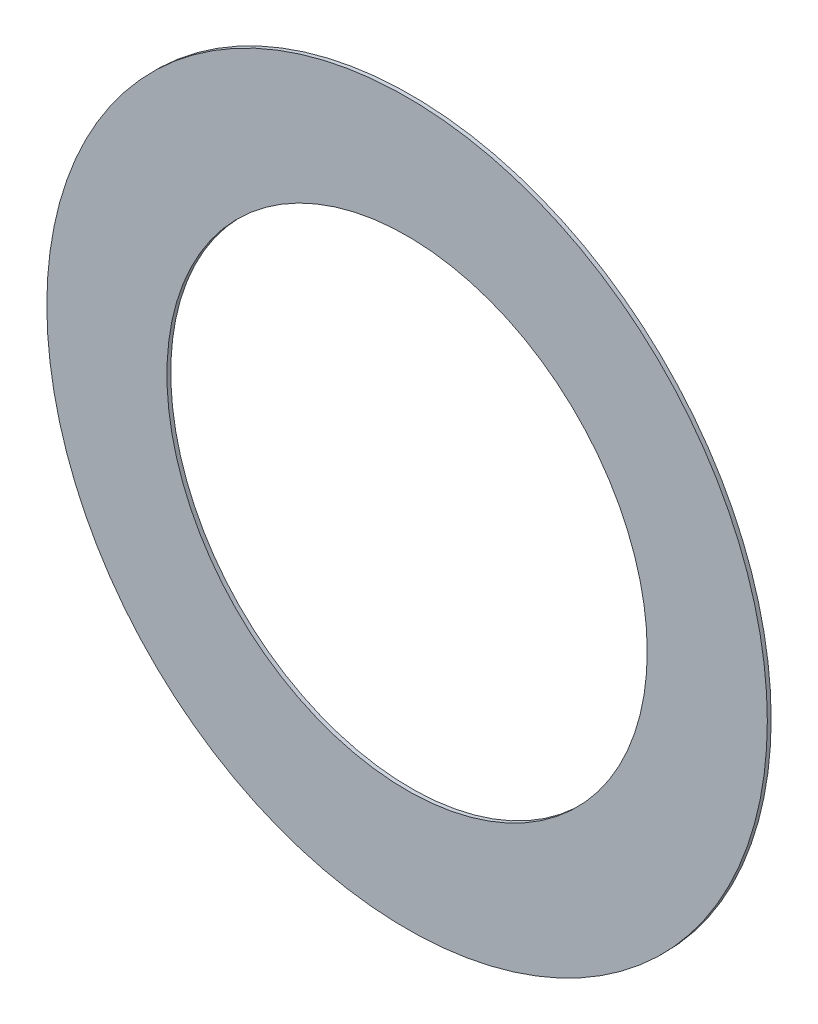
ISO-10303-21;
HEADER;
FILE_DESCRIPTION(('STEP AP214'),'2;1');
FILE_NAME('part.step','',(''),(''),'','','');
FILE_SCHEMA(('AUTOMOTIVE_DESIGN { 1 0 10303 214 1 1 1 1 }'));
ENDSEC;
DATA;
#1=APPLICATION_CONTEXT('core data for automotive mechanical design processes');
#2=APPLICATION_PROTOCOL_DEFINITION('international standard','automotive_design',2000,#1);
#3=PRODUCT_CONTEXT('',#1,'mechanical');
#4=PRODUCT('Part','Part','',(#3));
#5=PRODUCT_RELATED_PRODUCT_CATEGORY('part','',(#4));
#6=PRODUCT_DEFINITION_FORMATION('','',#4);
#7=PRODUCT_DEFINITION_CONTEXT('part definition',#1,'design');
#8=PRODUCT_DEFINITION('design','',#6,#7);
#9=PRODUCT_DEFINITION_SHAPE('','',#8);
#10=(LENGTH_UNIT() NAMED_UNIT(*) SI_UNIT(.MILLI.,.METRE.));
#11=(NAMED_UNIT(*) PLANE_ANGLE_UNIT() SI_UNIT($,.RADIAN.));
#12=(NAMED_UNIT(*) SI_UNIT($,.STERADIAN.) SOLID_ANGLE_UNIT());
#13=UNCERTAINTY_MEASURE_WITH_UNIT(LENGTH_MEASURE(1.E-05),#10,'distance_accuracy_value','');
#14=(GEOMETRIC_REPRESENTATION_CONTEXT(3) GLOBAL_UNCERTAINTY_ASSIGNED_CONTEXT((#13)) GLOBAL_UNIT_ASSIGNED_CONTEXT((#10,
#11,#12)) REPRESENTATION_CONTEXT('',''));
#15=CARTESIAN_POINT('',(0.,0.,0.));
#16=DIRECTION('',(0.,0.,1.));
#17=DIRECTION('',(1.,0.,0.));
#18=AXIS2_PLACEMENT_3D('',#15,#16,#17);
#19=CARTESIAN_POINT('',(0.,0.,0.0127));
#20=DIRECTION('',(0.,0.,1.));
#21=DIRECTION('',(1.,0.,0.));
#22=AXIS2_PLACEMENT_3D('',#19,#20,#21);
#23=PLANE('',#22);
#24=CARTESIAN_POINT('',(0.,0.,0.0127));
#25=DIRECTION('',(0.,0.,1.));
#26=DIRECTION('',(1.,0.,0.));
#27=AXIS2_PLACEMENT_3D('',#24,#25,#26);
#28=CIRCLE('',#27,2.38125);
#29=CARTESIAN_POINT('',(2.38125,0.,0.0127));
#30=VERTEX_POINT('',#29);
#31=EDGE_CURVE('E10',#30,#30,#28,.T.);
#32=ORIENTED_EDGE('',*,*,#31,.T.);
#33=EDGE_LOOP('',(#32));
#34=FACE_BOUND('',#33,.T.);
#35=CARTESIAN_POINT('',(0.,0.,0.0127));
#36=DIRECTION('',(0.,0.,1.));
#37=DIRECTION('',(1.,0.,0.));
#38=AXIS2_PLACEMENT_3D('',#35,#36,#37);
#39=CIRCLE('',#38,1.5875);
#40=CARTESIAN_POINT('',(1.5875,0.,0.0127));
#41=VERTEX_POINT('',#40);
#42=EDGE_CURVE('E43',#41,#41,#39,.T.);
#43=ORIENTED_EDGE('',*,*,#42,.F.);
#44=EDGE_LOOP('',(#43));
#45=FACE_BOUND('',#44,.T.);
#46=ADVANCED_FACE('F32',(#34,#45),#23,.T.);
#47=CARTESIAN_POINT('',(0.,0.,-0.0127));
#48=DIRECTION('',(0.,0.,1.));
#49=DIRECTION('',(1.,0.,0.));
#50=AXIS2_PLACEMENT_3D('',#47,#48,#49);
#51=PLANE('',#50);
#52=CARTESIAN_POINT('',(0.,0.,-0.0127));
#53=DIRECTION('',(0.,0.,1.));
#54=DIRECTION('',(1.,0.,0.));
#55=AXIS2_PLACEMENT_3D('',#52,#53,#54);
#56=CIRCLE('',#55,2.38125);
#57=CARTESIAN_POINT('',(2.38125,0.,-0.0127));
#58=VERTEX_POINT('',#57);
#59=EDGE_CURVE('E36',#58,#58,#56,.T.);
#60=ORIENTED_EDGE('',*,*,#59,.F.);
#61=EDGE_LOOP('',(#60));
#62=FACE_BOUND('',#61,.T.);
#63=CARTESIAN_POINT('',(0.,0.,-0.0127));
#64=DIRECTION('',(0.,0.,1.));
#65=DIRECTION('',(1.,0.,0.));
#66=AXIS2_PLACEMENT_3D('',#63,#64,#65);
#67=CIRCLE('',#66,1.5875);
#68=CARTESIAN_POINT('',(1.5875,0.,-0.0127));
#69=VERTEX_POINT('',#68);
#70=EDGE_CURVE('E45',#69,#69,#67,.T.);
#71=ORIENTED_EDGE('',*,*,#70,.T.);
#72=EDGE_LOOP('',(#71));
#73=FACE_BOUND('',#72,.T.);
#74=ADVANCED_FACE('F55',(#62,#73),#51,.F.);
#75=CARTESIAN_POINT('',(0.,0.,0.0127));
#76=DIRECTION('',(0.,0.,-1.));
#77=DIRECTION('',(-1.,0.,0.));
#78=AXIS2_PLACEMENT_3D('',#75,#76,#77);
#79=CYLINDRICAL_SURFACE('',#78,2.38125);
#80=ORIENTED_EDGE('',*,*,#31,.F.);
#81=EDGE_LOOP('',(#80));
#82=FACE_BOUND('',#81,.T.);
#83=ORIENTED_EDGE('',*,*,#59,.T.);
#84=EDGE_LOOP('',(#83));
#85=FACE_BOUND('',#84,.T.);
#86=ADVANCED_FACE('F34',(#82,#85),#79,.T.);
#87=CARTESIAN_POINT('',(0.,0.,0.0127));
#88=DIRECTION('',(0.,0.,-1.));
#89=DIRECTION('',(-1.,0.,0.));
#90=AXIS2_PLACEMENT_3D('',#87,#88,#89);
#91=CYLINDRICAL_SURFACE('',#90,1.5875);
#92=ORIENTED_EDGE('',*,*,#42,.T.);
#93=EDGE_LOOP('',(#92));
#94=FACE_BOUND('',#93,.T.);
#95=ORIENTED_EDGE('',*,*,#70,.F.);
#96=EDGE_LOOP('',(#95));
#97=FACE_BOUND('',#96,.T.);
#98=ADVANCED_FACE('F51',(#94,#97),#91,.F.);
#99=CLOSED_SHELL('',(#46,#74,#86,#98));
#100=MANIFOLD_SOLID_BREP('B2',#99);
#101=ADVANCED_BREP_SHAPE_REPRESENTATION('',(#18,#100),#14);
#102=SHAPE_DEFINITION_REPRESENTATION(#9,#101);
ENDSEC;
END-ISO-10303-21;
